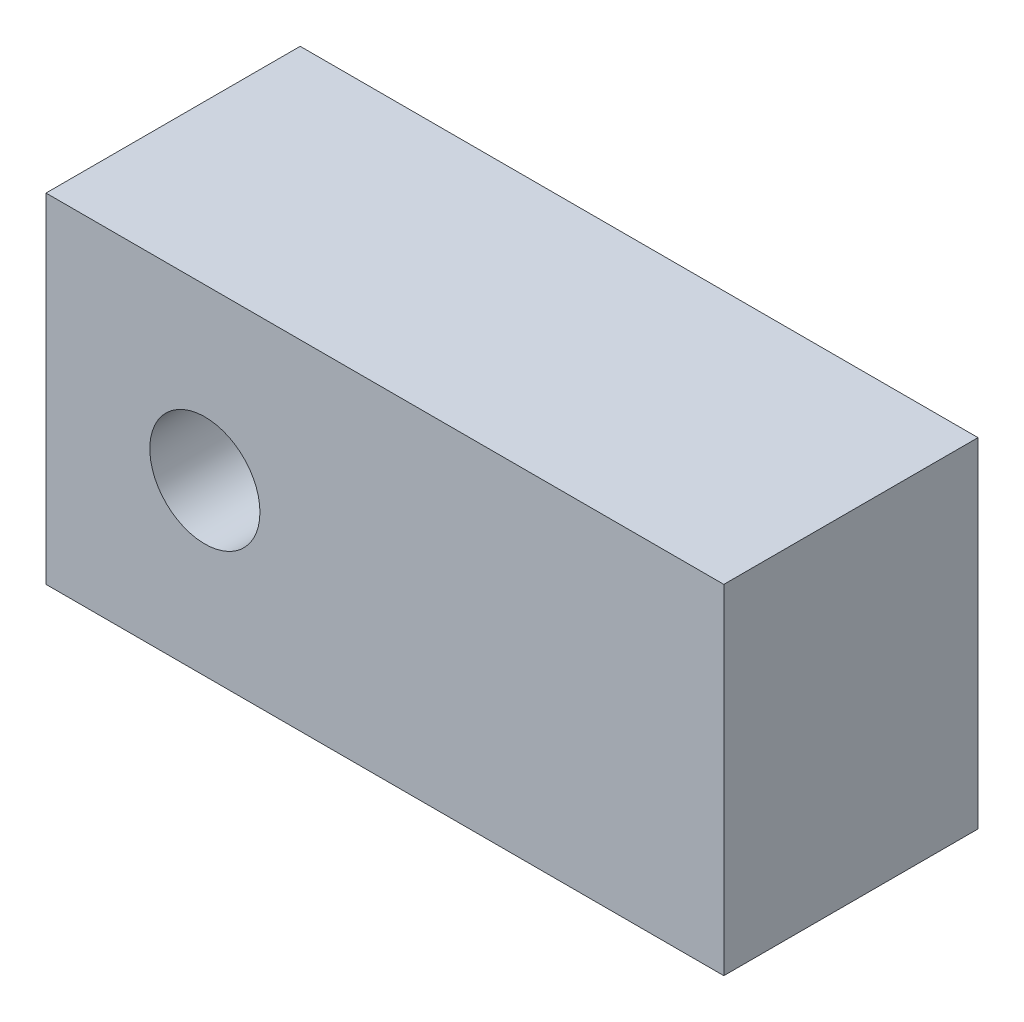
ISO-10303-21;
HEADER;
FILE_DESCRIPTION(('STEP AP214'),'2;1');
FILE_NAME('part.step','',(''),(''),'','','');
FILE_SCHEMA(('AUTOMOTIVE_DESIGN { 1 0 10303 214 1 1 1 1 }'));
ENDSEC;
DATA;
#1=APPLICATION_CONTEXT('core data for automotive mechanical design processes');
#2=APPLICATION_PROTOCOL_DEFINITION('international standard','automotive_design',2000,#1);
#3=PRODUCT_CONTEXT('',#1,'mechanical');
#4=PRODUCT('Part','Part','',(#3));
#5=PRODUCT_RELATED_PRODUCT_CATEGORY('part','',(#4));
#6=PRODUCT_DEFINITION_FORMATION('','',#4);
#7=PRODUCT_DEFINITION_CONTEXT('part definition',#1,'design');
#8=PRODUCT_DEFINITION('design','',#6,#7);
#9=PRODUCT_DEFINITION_SHAPE('','',#8);
#10=(LENGTH_UNIT() NAMED_UNIT(*) SI_UNIT(.MILLI.,.METRE.));
#11=(NAMED_UNIT(*) PLANE_ANGLE_UNIT() SI_UNIT($,.RADIAN.));
#12=(NAMED_UNIT(*) SI_UNIT($,.STERADIAN.) SOLID_ANGLE_UNIT());
#13=UNCERTAINTY_MEASURE_WITH_UNIT(LENGTH_MEASURE(1.E-05),#10,'distance_accuracy_value','');
#14=(GEOMETRIC_REPRESENTATION_CONTEXT(3) GLOBAL_UNCERTAINTY_ASSIGNED_CONTEXT((#13)) GLOBAL_UNIT_ASSIGNED_CONTEXT((#10,
#11,#12)) REPRESENTATION_CONTEXT('',''));
#15=CARTESIAN_POINT('',(0.,0.,0.));
#16=DIRECTION('',(0.,0.,1.));
#17=DIRECTION('',(1.,0.,0.));
#18=AXIS2_PLACEMENT_3D('',#15,#16,#17);
#19=CARTESIAN_POINT('',(0.,0.,7.62));
#20=DIRECTION('',(1.,0.,0.));
#21=DIRECTION('',(0.,1.,0.));
#22=AXIS2_PLACEMENT_3D('',#19,#20,#21);
#23=PLANE('',#22);
#24=DIRECTION('',(0.,-1.,0.));
#25=VECTOR('',#24,1.);
#26=CARTESIAN_POINT('',(0.,0.,0.));
#27=LINE('',#26,#25);
#28=CARTESIAN_POINT('',(-1.14491749414469E-13,10.1599999999999,0.));
#29=VERTEX_POINT('',#28);
#30=CARTESIAN_POINT('',(0.,0.,0.));
#31=VERTEX_POINT('',#30);
#32=EDGE_CURVE('E111',#29,#31,#27,.T.);
#33=ORIENTED_EDGE('',*,*,#32,.T.);
#34=DIRECTION('',(0.,0.,-1.));
#35=VECTOR('',#34,1.);
#36=CARTESIAN_POINT('',(0.,0.,7.62));
#37=LINE('',#36,#35);
#38=CARTESIAN_POINT('',(0.,0.,7.62));
#39=VERTEX_POINT('',#38);
#40=EDGE_CURVE('E11',#39,#31,#37,.T.);
#41=ORIENTED_EDGE('',*,*,#40,.F.);
#42=DIRECTION('',(0.,-1.,0.));
#43=VECTOR('',#42,1.);
#44=CARTESIAN_POINT('',(0.,0.,7.62));
#45=LINE('',#44,#43);
#46=CARTESIAN_POINT('',(-1.14491749414469E-13,10.1599999999999,7.62));
#47=VERTEX_POINT('',#46);
#48=EDGE_CURVE('E95',#47,#39,#45,.T.);
#49=ORIENTED_EDGE('',*,*,#48,.F.);
#50=DIRECTION('',(0.,0.,-1.));
#51=VECTOR('',#50,1.);
#52=CARTESIAN_POINT('',(-1.14491749414469E-13,10.1599999999999,7.62));
#53=LINE('',#52,#51);
#54=EDGE_CURVE('E107',#47,#29,#53,.T.);
#55=ORIENTED_EDGE('',*,*,#54,.T.);
#56=EDGE_LOOP('',(#33,#41,#49,#55));
#57=FACE_BOUND('',#56,.T.);
#58=ADVANCED_FACE('F43',(#57),#23,.F.);
#59=CARTESIAN_POINT('',(0.,0.,7.62));
#60=DIRECTION('',(0.,1.,0.));
#61=DIRECTION('',(0.,0.,1.));
#62=AXIS2_PLACEMENT_3D('',#59,#60,#61);
#63=PLANE('',#62);
#64=DIRECTION('',(1.,0.,0.));
#65=VECTOR('',#64,1.);
#66=CARTESIAN_POINT('',(0.,0.,0.));
#67=LINE('',#66,#65);
#68=CARTESIAN_POINT('',(20.3199999999999,0.,0.));
#69=VERTEX_POINT('',#68);
#70=EDGE_CURVE('E100',#31,#69,#67,.T.);
#71=ORIENTED_EDGE('',*,*,#70,.T.);
#72=DIRECTION('',(0.,0.,-1.));
#73=VECTOR('',#72,1.);
#74=CARTESIAN_POINT('',(20.3199999999999,0.,7.62));
#75=LINE('',#74,#73);
#76=CARTESIAN_POINT('',(20.3199999999999,0.,7.62));
#77=VERTEX_POINT('',#76);
#78=EDGE_CURVE('E52',#77,#69,#75,.T.);
#79=ORIENTED_EDGE('',*,*,#78,.F.);
#80=DIRECTION('',(1.,0.,0.));
#81=VECTOR('',#80,1.);
#82=CARTESIAN_POINT('',(0.,0.,7.62));
#83=LINE('',#82,#81);
#84=EDGE_CURVE('E90',#39,#77,#83,.T.);
#85=ORIENTED_EDGE('',*,*,#84,.F.);
#86=ORIENTED_EDGE('',*,*,#40,.T.);
#87=EDGE_LOOP('',(#71,#79,#85,#86));
#88=FACE_BOUND('',#87,.T.);
#89=ADVANCED_FACE('F99',(#88),#63,.F.);
#90=CARTESIAN_POINT('',(20.3199999999999,0.,7.62));
#91=DIRECTION('',(-1.,0.,0.));
#92=DIRECTION('',(0.,-1.,0.));
#93=AXIS2_PLACEMENT_3D('',#90,#91,#92);
#94=PLANE('',#93);
#95=DIRECTION('',(0.,1.,0.));
#96=VECTOR('',#95,1.);
#97=CARTESIAN_POINT('',(20.3199999999999,0.,0.));
#98=LINE('',#97,#96);
#99=CARTESIAN_POINT('',(20.3199999999999,10.1599999999999,0.));
#100=VERTEX_POINT('',#99);
#101=EDGE_CURVE('E77',#69,#100,#98,.T.);
#102=ORIENTED_EDGE('',*,*,#101,.T.);
#103=DIRECTION('',(0.,0.,-1.));
#104=VECTOR('',#103,1.);
#105=CARTESIAN_POINT('',(20.3199999999999,10.1599999999999,7.62));
#106=LINE('',#105,#104);
#107=CARTESIAN_POINT('',(20.3199999999999,10.1599999999999,7.62));
#108=VERTEX_POINT('',#107);
#109=EDGE_CURVE('E102',#108,#100,#106,.T.);
#110=ORIENTED_EDGE('',*,*,#109,.F.);
#111=DIRECTION('',(0.,1.,0.));
#112=VECTOR('',#111,1.);
#113=CARTESIAN_POINT('',(20.3199999999999,0.,7.62));
#114=LINE('',#113,#112);
#115=EDGE_CURVE('E93',#77,#108,#114,.T.);
#116=ORIENTED_EDGE('',*,*,#115,.F.);
#117=ORIENTED_EDGE('',*,*,#78,.T.);
#118=EDGE_LOOP('',(#102,#110,#116,#117));
#119=FACE_BOUND('',#118,.T.);
#120=ADVANCED_FACE('F103',(#119),#94,.F.);
#121=CARTESIAN_POINT('',(-1.14491749414469E-13,10.1599999999999,7.62));
#122=DIRECTION('',(0.,-1.,0.));
#123=DIRECTION('',(0.,0.,-1.));
#124=AXIS2_PLACEMENT_3D('',#121,#122,#123);
#125=PLANE('',#124);
#126=DIRECTION('',(-1.,0.,0.));
#127=VECTOR('',#126,1.);
#128=CARTESIAN_POINT('',(-1.14491749414469E-13,10.1599999999999,0.));
#129=LINE('',#128,#127);
#130=EDGE_CURVE('E83',#100,#29,#129,.T.);
#131=ORIENTED_EDGE('',*,*,#130,.T.);
#132=ORIENTED_EDGE('',*,*,#54,.F.);
#133=DIRECTION('',(-1.,0.,0.));
#134=VECTOR('',#133,1.);
#135=CARTESIAN_POINT('',(-1.14491749414469E-13,10.1599999999999,7.62));
#136=LINE('',#135,#134);
#137=EDGE_CURVE('E60',#108,#47,#136,.T.);
#138=ORIENTED_EDGE('',*,*,#137,.F.);
#139=ORIENTED_EDGE('',*,*,#109,.T.);
#140=EDGE_LOOP('',(#131,#132,#138,#139));
#141=FACE_BOUND('',#140,.T.);
#142=ADVANCED_FACE('F125',(#141),#125,.F.);
#143=CARTESIAN_POINT('',(0.,0.,7.62));
#144=DIRECTION('',(0.,0.,-1.));
#145=DIRECTION('',(-1.,0.,0.));
#146=AXIS2_PLACEMENT_3D('',#143,#144,#145);
#147=PLANE('',#146);
#148=CARTESIAN_POINT('',(4.7625,5.07999999999997,7.62));
#149=DIRECTION('',(0.,0.,1.));
#150=DIRECTION('',(1.,0.,0.));
#151=AXIS2_PLACEMENT_3D('',#148,#149,#150);
#152=CIRCLE('',#151,1.651);
#153=CARTESIAN_POINT('',(6.4135,5.07999999999997,7.62));
#154=VERTEX_POINT('',#153);
#155=EDGE_CURVE('E132',#154,#154,#152,.T.);
#156=ORIENTED_EDGE('',*,*,#155,.F.);
#157=EDGE_LOOP('',(#156));
#158=FACE_BOUND('',#157,.T.);
#159=ORIENTED_EDGE('',*,*,#48,.T.);
#160=ORIENTED_EDGE('',*,*,#84,.T.);
#161=ORIENTED_EDGE('',*,*,#115,.T.);
#162=ORIENTED_EDGE('',*,*,#137,.T.);
#163=EDGE_LOOP('',(#159,#160,#161,#162));
#164=FACE_BOUND('',#163,.T.);
#165=ADVANCED_FACE('F91',(#158,#164),#147,.F.);
#166=CARTESIAN_POINT('',(0.,0.,0.));
#167=DIRECTION('',(0.,0.,-1.));
#168=DIRECTION('',(-1.,0.,0.));
#169=AXIS2_PLACEMENT_3D('',#166,#167,#168);
#170=PLANE('',#169);
#171=CARTESIAN_POINT('',(4.7625,5.07999999999997,0.));
#172=DIRECTION('',(0.,0.,1.));
#173=DIRECTION('',(1.,0.,0.));
#174=AXIS2_PLACEMENT_3D('',#171,#172,#173);
#175=CIRCLE('',#174,1.651);
#176=CARTESIAN_POINT('',(6.4135,5.07999999999997,0.));
#177=VERTEX_POINT('',#176);
#178=EDGE_CURVE('E115',#177,#177,#175,.T.);
#179=ORIENTED_EDGE('',*,*,#178,.T.);
#180=EDGE_LOOP('',(#179));
#181=FACE_BOUND('',#180,.T.);
#182=ORIENTED_EDGE('',*,*,#32,.F.);
#183=ORIENTED_EDGE('',*,*,#130,.F.);
#184=ORIENTED_EDGE('',*,*,#101,.F.);
#185=ORIENTED_EDGE('',*,*,#70,.F.);
#186=EDGE_LOOP('',(#182,#183,#184,#185));
#187=FACE_BOUND('',#186,.T.);
#188=ADVANCED_FACE('F128',(#181,#187),#170,.T.);
#189=CARTESIAN_POINT('',(4.7625,5.07999999999997,0.));
#190=DIRECTION('',(0.,0.,1.));
#191=DIRECTION('',(1.,0.,0.));
#192=AXIS2_PLACEMENT_3D('',#189,#190,#191);
#193=CYLINDRICAL_SURFACE('',#192,1.651);
#194=CARTESIAN_POINT('',(6.4135,5.07999999999997,0.));
#195=CARTESIAN_POINT('',(6.4135,5.07999999999997,0.0793749999999998));
#196=CARTESIAN_POINT('',(6.4135,5.07999999999997,0.15875));
#197=CARTESIAN_POINT('',(6.4135,5.07999999999997,0.3175));
#198=CARTESIAN_POINT('',(6.4135,5.07999999999997,0.396875));
#199=CARTESIAN_POINT('',(6.4135,5.07999999999997,0.555625));
#200=CARTESIAN_POINT('',(6.4135,5.07999999999997,0.635));
#201=CARTESIAN_POINT('',(6.4135,5.07999999999997,0.79375));
#202=CARTESIAN_POINT('',(6.4135,5.07999999999997,0.873125));
#203=CARTESIAN_POINT('',(6.4135,5.07999999999997,1.031875));
#204=CARTESIAN_POINT('',(6.4135,5.07999999999997,1.11125));
#205=CARTESIAN_POINT('',(6.4135,5.07999999999997,1.27));
#206=CARTESIAN_POINT('',(6.4135,5.07999999999997,1.349375));
#207=CARTESIAN_POINT('',(6.4135,5.07999999999997,1.508125));
#208=CARTESIAN_POINT('',(6.4135,5.07999999999997,1.5875));
#209=CARTESIAN_POINT('',(6.4135,5.07999999999997,1.74625));
#210=CARTESIAN_POINT('',(6.4135,5.07999999999997,1.825625));
#211=CARTESIAN_POINT('',(6.4135,5.07999999999997,1.984375));
#212=CARTESIAN_POINT('',(6.4135,5.07999999999997,2.06375));
#213=CARTESIAN_POINT('',(6.4135,5.07999999999997,2.2225));
#214=CARTESIAN_POINT('',(6.4135,5.07999999999997,2.301875));
#215=CARTESIAN_POINT('',(6.4135,5.07999999999997,2.460625));
#216=CARTESIAN_POINT('',(6.4135,5.07999999999997,2.54));
#217=CARTESIAN_POINT('',(6.4135,5.07999999999997,2.69875));
#218=CARTESIAN_POINT('',(6.4135,5.07999999999997,2.778125));
#219=CARTESIAN_POINT('',(6.4135,5.07999999999997,2.936875));
#220=CARTESIAN_POINT('',(6.4135,5.07999999999997,3.01625));
#221=CARTESIAN_POINT('',(6.4135,5.07999999999997,3.175));
#222=CARTESIAN_POINT('',(6.4135,5.07999999999997,3.254375));
#223=CARTESIAN_POINT('',(6.4135,5.07999999999997,3.413125));
#224=CARTESIAN_POINT('',(6.4135,5.07999999999997,3.4925));
#225=CARTESIAN_POINT('',(6.4135,5.07999999999997,3.65125));
#226=CARTESIAN_POINT('',(6.4135,5.07999999999997,3.730625));
#227=CARTESIAN_POINT('',(6.4135,5.07999999999997,3.889375));
#228=CARTESIAN_POINT('',(6.4135,5.07999999999997,3.96875));
#229=CARTESIAN_POINT('',(6.4135,5.07999999999997,4.1275));
#230=CARTESIAN_POINT('',(6.4135,5.07999999999997,4.206875));
#231=CARTESIAN_POINT('',(6.4135,5.07999999999997,4.365625));
#232=CARTESIAN_POINT('',(6.4135,5.07999999999997,4.445));
#233=CARTESIAN_POINT('',(6.4135,5.07999999999997,4.60375));
#234=CARTESIAN_POINT('',(6.4135,5.07999999999997,4.683125));
#235=CARTESIAN_POINT('',(6.4135,5.07999999999997,4.841875));
#236=CARTESIAN_POINT('',(6.4135,5.07999999999997,4.92125));
#237=CARTESIAN_POINT('',(6.4135,5.07999999999997,5.08));
#238=CARTESIAN_POINT('',(6.4135,5.07999999999997,5.159375));
#239=CARTESIAN_POINT('',(6.4135,5.07999999999997,5.318125));
#240=CARTESIAN_POINT('',(6.4135,5.07999999999997,5.3975));
#241=CARTESIAN_POINT('',(6.4135,5.07999999999997,5.55625));
#242=CARTESIAN_POINT('',(6.4135,5.07999999999997,5.635625));
#243=CARTESIAN_POINT('',(6.4135,5.07999999999997,5.794375));
#244=CARTESIAN_POINT('',(6.4135,5.07999999999997,5.87375));
#245=CARTESIAN_POINT('',(6.4135,5.07999999999997,6.0325));
#246=CARTESIAN_POINT('',(6.4135,5.07999999999997,6.111875));
#247=CARTESIAN_POINT('',(6.4135,5.07999999999997,6.270625));
#248=CARTESIAN_POINT('',(6.4135,5.07999999999997,6.35));
#249=CARTESIAN_POINT('',(6.4135,5.07999999999997,6.50875));
#250=CARTESIAN_POINT('',(6.4135,5.07999999999997,6.588125));
#251=CARTESIAN_POINT('',(6.4135,5.07999999999997,6.746875));
#252=CARTESIAN_POINT('',(6.4135,5.07999999999997,6.82625));
#253=CARTESIAN_POINT('',(6.4135,5.07999999999997,6.985));
#254=CARTESIAN_POINT('',(6.4135,5.07999999999997,7.064375));
#255=CARTESIAN_POINT('',(6.4135,5.07999999999997,7.223125));
#256=CARTESIAN_POINT('',(6.4135,5.07999999999997,7.3025));
#257=CARTESIAN_POINT('',(6.4135,5.07999999999997,7.46125));
#258=CARTESIAN_POINT('',(6.4135,5.07999999999997,7.540625));
#259=CARTESIAN_POINT('',(6.4135,5.07999999999997,7.62));
#260=B_SPLINE_CURVE_WITH_KNOTS('',3,(#194,#195,#196,#197,#198,#199,#200,#201,#202,#203,#204,
#205,#206,#207,#208,#209,#210,#211,#212,#213,#214,#215,#216,#217,#218,#219,#220,#221,#222,#223,
#224,#225,#226,#227,#228,#229,#230,#231,#232,#233,#234,#235,#236,#237,#238,#239,#240,#241,#242,
#243,#244,#245,#246,#247,#248,#249,#250,#251,#252,#253,#254,#255,#256,#257,#258,#259),
.UNSPECIFIED.,.F.,.F.,(4,2,2,2,2,2,2,2,2,2,2,2,2,2,2,2,2,2,2,2,2,2,2,2,2,2,2,2,2,2,2,2,4),(0.,
0.238125,0.47625,0.714375,0.9525,1.190625,1.42875,1.666875,1.905,2.143125,2.38125,2.619375,
2.8575,3.095625,3.33375,3.571875,3.81,4.048125,4.28625,4.524375,4.7625,5.000625,5.23875,
5.476875,5.715,5.953125,6.19125,6.429375,6.6675,6.905625,7.14375,7.381875,7.62),.UNSPECIFIED.);
#261=EDGE_CURVE('BSEAM141',#177,#154,#260,.T.);
#262=ORIENTED_EDGE('',*,*,#178,.F.);
#263=ORIENTED_EDGE('',*,*,#155,.T.);
#264=ORIENTED_EDGE('',*,*,#261,.T.);
#265=ORIENTED_EDGE('',*,*,#261,.F.);
#266=EDGE_LOOP('',(#262,#264,#263,#265));
#267=FACE_BOUND('',#266,.T.);
#268=ADVANCED_FACE('F141',(#267),#193,.F.);
#269=CLOSED_SHELL('',(#58,#89,#120,#142,#165,#188,#268));
#270=MANIFOLD_SOLID_BREP('B2',#269);
#271=ADVANCED_BREP_SHAPE_REPRESENTATION('',(#18,#270),#14);
#272=SHAPE_DEFINITION_REPRESENTATION(#9,#271);
ENDSEC;
END-ISO-10303-21;
